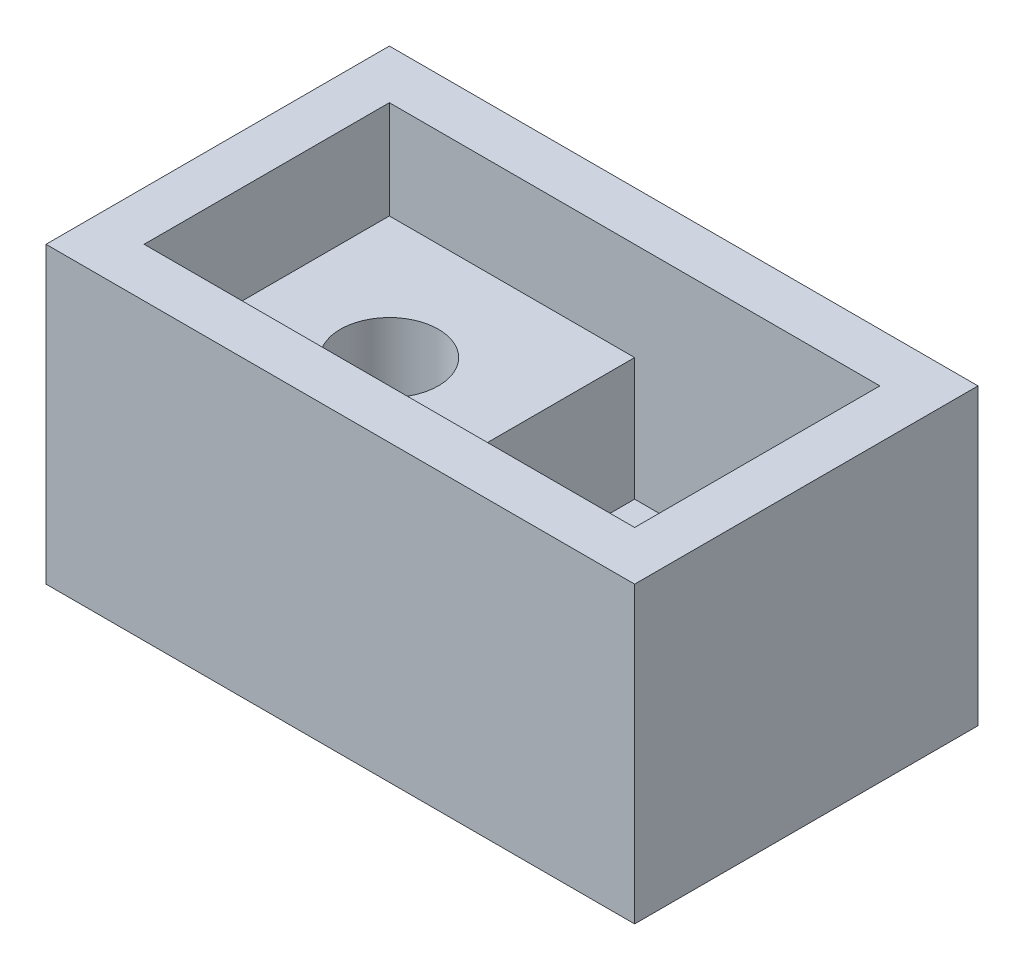
ISO-10303-21;
HEADER;
FILE_DESCRIPTION(('STEP AP214'),'2;1');
FILE_NAME('part.step','',(''),(''),'','','');
FILE_SCHEMA(('AUTOMOTIVE_DESIGN { 1 0 10303 214 1 1 1 1 }'));
ENDSEC;
DATA;
#1=APPLICATION_CONTEXT('core data for automotive mechanical design processes');
#2=APPLICATION_PROTOCOL_DEFINITION('international standard','automotive_design',2000,#1);
#3=PRODUCT_CONTEXT('',#1,'mechanical');
#4=PRODUCT('Part','Part','',(#3));
#5=PRODUCT_RELATED_PRODUCT_CATEGORY('part','',(#4));
#6=PRODUCT_DEFINITION_FORMATION('','',#4);
#7=PRODUCT_DEFINITION_CONTEXT('part definition',#1,'design');
#8=PRODUCT_DEFINITION('design','',#6,#7);
#9=PRODUCT_DEFINITION_SHAPE('','',#8);
#10=(LENGTH_UNIT() NAMED_UNIT(*) SI_UNIT(.MILLI.,.METRE.));
#11=(NAMED_UNIT(*) PLANE_ANGLE_UNIT() SI_UNIT($,.RADIAN.));
#12=(NAMED_UNIT(*) SI_UNIT($,.STERADIAN.) SOLID_ANGLE_UNIT());
#13=UNCERTAINTY_MEASURE_WITH_UNIT(LENGTH_MEASURE(1.E-05),#10,'distance_accuracy_value','');
#14=(GEOMETRIC_REPRESENTATION_CONTEXT(3) GLOBAL_UNCERTAINTY_ASSIGNED_CONTEXT((#13)) GLOBAL_UNIT_ASSIGNED_CONTEXT((#10,
#11,#12)) REPRESENTATION_CONTEXT('',''));
#15=CARTESIAN_POINT('',(0.,0.,0.));
#16=DIRECTION('',(0.,0.,1.));
#17=DIRECTION('',(1.,0.,0.));
#18=AXIS2_PLACEMENT_3D('',#15,#16,#17);
#19=CARTESIAN_POINT('',(88.9,-152.4,-88.9));
#20=DIRECTION('',(0.,1.,0.));
#21=DIRECTION('',(0.,0.,1.));
#22=AXIS2_PLACEMENT_3D('',#19,#20,#21);
#23=CYLINDRICAL_SURFACE('',#22,25.4);
#24=CARTESIAN_POINT('',(88.9,-152.4,-88.9));
#25=DIRECTION('',(0.,1.,0.));
#26=DIRECTION('',(0.,0.,1.));
#27=AXIS2_PLACEMENT_3D('',#24,#25,#26);
#28=CIRCLE('',#27,25.4);
#29=CARTESIAN_POINT('',(88.9,-152.4,-63.5));
#30=VERTEX_POINT('',#29);
#31=EDGE_CURVE('E180',#30,#30,#28,.T.);
#32=CARTESIAN_POINT('',(88.9,-50.8,-88.9));
#33=DIRECTION('',(0.,1.,0.));
#34=DIRECTION('',(0.,0.,1.));
#35=AXIS2_PLACEMENT_3D('',#32,#33,#34);
#36=CIRCLE('',#35,25.4);
#37=CARTESIAN_POINT('',(88.9,-50.8,-63.5));
#38=VERTEX_POINT('',#37);
#39=EDGE_CURVE('E175',#38,#38,#36,.F.);
#40=CARTESIAN_POINT('',(88.9,-152.4,-63.5));
#41=CARTESIAN_POINT('',(88.9,-151.341666666667,-63.5));
#42=CARTESIAN_POINT('',(88.9,-150.283333333333,-63.5));
#43=CARTESIAN_POINT('',(88.9,-148.166666666667,-63.5));
#44=CARTESIAN_POINT('',(88.9,-147.108333333333,-63.5));
#45=CARTESIAN_POINT('',(88.9,-144.991666666667,-63.5));
#46=CARTESIAN_POINT('',(88.9,-143.933333333333,-63.5));
#47=CARTESIAN_POINT('',(88.9,-141.816666666667,-63.5));
#48=CARTESIAN_POINT('',(88.9,-140.758333333333,-63.5));
#49=CARTESIAN_POINT('',(88.9,-138.641666666667,-63.5));
#50=CARTESIAN_POINT('',(88.9,-137.583333333333,-63.5));
#51=CARTESIAN_POINT('',(88.9,-135.466666666667,-63.5));
#52=CARTESIAN_POINT('',(88.9,-134.408333333333,-63.5));
#53=CARTESIAN_POINT('',(88.9,-132.291666666667,-63.5));
#54=CARTESIAN_POINT('',(88.9,-131.233333333333,-63.5));
#55=CARTESIAN_POINT('',(88.9,-129.116666666667,-63.5));
#56=CARTESIAN_POINT('',(88.9,-128.058333333333,-63.5));
#57=CARTESIAN_POINT('',(88.9,-125.941666666667,-63.5));
#58=CARTESIAN_POINT('',(88.9,-124.883333333333,-63.5));
#59=CARTESIAN_POINT('',(88.9,-122.766666666667,-63.5));
#60=CARTESIAN_POINT('',(88.9,-121.708333333333,-63.5));
#61=CARTESIAN_POINT('',(88.9,-119.591666666667,-63.5));
#62=CARTESIAN_POINT('',(88.9,-118.533333333333,-63.5));
#63=CARTESIAN_POINT('',(88.9,-116.416666666667,-63.5));
#64=CARTESIAN_POINT('',(88.9,-115.358333333333,-63.5));
#65=CARTESIAN_POINT('',(88.9,-113.241666666667,-63.5));
#66=CARTESIAN_POINT('',(88.9,-112.183333333333,-63.5));
#67=CARTESIAN_POINT('',(88.9,-110.066666666667,-63.5));
#68=CARTESIAN_POINT('',(88.9,-109.008333333333,-63.5));
#69=CARTESIAN_POINT('',(88.9,-106.891666666667,-63.5));
#70=CARTESIAN_POINT('',(88.9,-105.833333333333,-63.5));
#71=CARTESIAN_POINT('',(88.9,-103.716666666667,-63.5));
#72=CARTESIAN_POINT('',(88.9,-102.658333333333,-63.5));
#73=CARTESIAN_POINT('',(88.9,-100.541666666667,-63.5));
#74=CARTESIAN_POINT('',(88.9,-99.4833333333333,-63.5));
#75=CARTESIAN_POINT('',(88.9,-97.3666666666667,-63.5));
#76=CARTESIAN_POINT('',(88.9,-96.3083333333333,-63.5));
#77=CARTESIAN_POINT('',(88.9,-94.1916666666667,-63.5));
#78=CARTESIAN_POINT('',(88.9,-93.1333333333333,-63.5));
#79=CARTESIAN_POINT('',(88.9,-91.0166666666667,-63.5));
#80=CARTESIAN_POINT('',(88.9,-89.9583333333333,-63.5));
#81=CARTESIAN_POINT('',(88.9,-87.8416666666667,-63.5));
#82=CARTESIAN_POINT('',(88.9,-86.7833333333333,-63.5));
#83=CARTESIAN_POINT('',(88.9,-84.6666666666667,-63.5));
#84=CARTESIAN_POINT('',(88.9,-83.6083333333333,-63.5));
#85=CARTESIAN_POINT('',(88.9,-81.4916666666667,-63.5));
#86=CARTESIAN_POINT('',(88.9,-80.4333333333333,-63.5));
#87=CARTESIAN_POINT('',(88.9,-78.3166666666667,-63.5));
#88=CARTESIAN_POINT('',(88.9,-77.2583333333333,-63.5));
#89=CARTESIAN_POINT('',(88.9,-75.1416666666667,-63.5));
#90=CARTESIAN_POINT('',(88.9,-74.0833333333333,-63.5));
#91=CARTESIAN_POINT('',(88.9,-71.9666666666667,-63.5));
#92=CARTESIAN_POINT('',(88.9,-70.9083333333333,-63.5));
#93=CARTESIAN_POINT('',(88.9,-68.7916666666667,-63.5));
#94=CARTESIAN_POINT('',(88.9,-67.7333333333333,-63.5));
#95=CARTESIAN_POINT('',(88.9,-65.6166666666667,-63.5));
#96=CARTESIAN_POINT('',(88.9,-64.5583333333333,-63.5));
#97=CARTESIAN_POINT('',(88.9,-62.4416666666667,-63.5));
#98=CARTESIAN_POINT('',(88.9,-61.3833333333333,-63.5));
#99=CARTESIAN_POINT('',(88.9,-59.2666666666667,-63.5));
#100=CARTESIAN_POINT('',(88.9,-58.2083333333333,-63.5));
#101=CARTESIAN_POINT('',(88.9,-56.0916666666667,-63.5));
#102=CARTESIAN_POINT('',(88.9,-55.0333333333333,-63.5));
#103=CARTESIAN_POINT('',(88.9,-52.9166666666667,-63.5));
#104=CARTESIAN_POINT('',(88.9,-51.8583333333333,-63.5));
#105=CARTESIAN_POINT('',(88.9,-50.8,-63.5));
#106=B_SPLINE_CURVE_WITH_KNOTS('',3,(#40,#41,#42,#43,#44,#45,#46,#47,#48,#49,#50,#51,#52,#53,
#54,#55,#56,#57,#58,#59,#60,#61,#62,#63,#64,#65,#66,#67,#68,#69,#70,#71,#72,#73,#74,#75,#76,#77,
#78,#79,#80,#81,#82,#83,#84,#85,#86,#87,#88,#89,#90,#91,#92,#93,#94,#95,#96,#97,#98,#99,#100,
#101,#102,#103,#104,#105),.UNSPECIFIED.,.F.,.F.,(4,2,2,2,2,2,2,2,2,2,2,2,2,2,2,2,2,2,2,2,2,2,2,
2,2,2,2,2,2,2,2,2,4),(0.,3.17500000000001,6.35000000000002,9.52500000000001,12.7,15.875,19.05,
22.225,25.4,28.575,31.75,34.925,38.1,41.275,44.45,47.625,50.8,53.975,57.15,60.325,63.5,66.675,
69.85,73.025,76.2,79.375,82.55,85.725,88.9,92.075,95.25,98.425,101.6),.UNSPECIFIED.);
#107=EDGE_CURVE('BSEAM35',#30,#38,#106,.T.);
#108=ORIENTED_EDGE('',*,*,#31,.F.);
#109=ORIENTED_EDGE('',*,*,#39,.F.);
#110=ORIENTED_EDGE('',*,*,#107,.T.);
#111=ORIENTED_EDGE('',*,*,#107,.F.);
#112=EDGE_LOOP('',(#108,#110,#109,#111));
#113=FACE_BOUND('',#112,.T.);
#114=ADVANCED_FACE('F35',(#113),#23,.F.);
#115=CARTESIAN_POINT('',(0.,-152.4,0.));
#116=DIRECTION('',(0.,0.,1.));
#117=DIRECTION('',(1.,0.,0.));
#118=AXIS2_PLACEMENT_3D('',#115,#116,#117);
#119=PLANE('',#118);
#120=DIRECTION('',(1.,0.,0.));
#121=VECTOR('',#120,1.);
#122=CARTESIAN_POINT('',(0.,0.,0.));
#123=LINE('',#122,#121);
#124=CARTESIAN_POINT('',(0.,0.,0.));
#125=VERTEX_POINT('',#124);
#126=CARTESIAN_POINT('',(304.8,0.,0.));
#127=VERTEX_POINT('',#126);
#128=EDGE_CURVE('E183',#125,#127,#123,.T.);
#129=ORIENTED_EDGE('',*,*,#128,.F.);
#130=DIRECTION('',(0.,1.,0.));
#131=VECTOR('',#130,1.);
#132=CARTESIAN_POINT('',(0.,-152.4,0.));
#133=LINE('',#132,#131);
#134=CARTESIAN_POINT('',(0.,-152.4,0.));
#135=VERTEX_POINT('',#134);
#136=EDGE_CURVE('E11',#135,#125,#133,.T.);
#137=ORIENTED_EDGE('',*,*,#136,.F.);
#138=DIRECTION('',(1.,0.,0.));
#139=VECTOR('',#138,1.);
#140=CARTESIAN_POINT('',(0.,-152.4,0.));
#141=LINE('',#140,#139);
#142=CARTESIAN_POINT('',(304.8,-152.4,0.));
#143=VERTEX_POINT('',#142);
#144=EDGE_CURVE('E184',#135,#143,#141,.T.);
#145=ORIENTED_EDGE('',*,*,#144,.T.);
#146=DIRECTION('',(0.,1.,0.));
#147=VECTOR('',#146,1.);
#148=CARTESIAN_POINT('',(304.8,-152.4,0.));
#149=LINE('',#148,#147);
#150=EDGE_CURVE('E84',#143,#127,#149,.T.);
#151=ORIENTED_EDGE('',*,*,#150,.T.);
#152=EDGE_LOOP('',(#129,#137,#145,#151));
#153=FACE_BOUND('',#152,.T.);
#154=ADVANCED_FACE('F37',(#153),#119,.T.);
#155=CARTESIAN_POINT('',(0.,-152.4,0.));
#156=DIRECTION('',(1.,0.,0.));
#157=DIRECTION('',(0.,0.,-1.));
#158=AXIS2_PLACEMENT_3D('',#155,#156,#157);
#159=PLANE('',#158);
#160=DIRECTION('',(0.,0.,-1.));
#161=VECTOR('',#160,1.);
#162=CARTESIAN_POINT('',(0.,0.,0.));
#163=LINE('',#162,#161);
#164=CARTESIAN_POINT('',(0.,0.,-177.8));
#165=VERTEX_POINT('',#164);
#166=EDGE_CURVE('E187',#125,#165,#163,.T.);
#167=ORIENTED_EDGE('',*,*,#166,.T.);
#168=DIRECTION('',(0.,1.,0.));
#169=VECTOR('',#168,1.);
#170=CARTESIAN_POINT('',(0.,-152.4,-177.8));
#171=LINE('',#170,#169);
#172=CARTESIAN_POINT('',(0.,-152.4,-177.8));
#173=VERTEX_POINT('',#172);
#174=EDGE_CURVE('E44',#173,#165,#171,.T.);
#175=ORIENTED_EDGE('',*,*,#174,.F.);
#176=DIRECTION('',(0.,0.,-1.));
#177=VECTOR('',#176,1.);
#178=CARTESIAN_POINT('',(0.,-152.4,0.));
#179=LINE('',#178,#177);
#180=EDGE_CURVE('E191',#135,#173,#179,.T.);
#181=ORIENTED_EDGE('',*,*,#180,.F.);
#182=ORIENTED_EDGE('',*,*,#136,.T.);
#183=EDGE_LOOP('',(#167,#175,#181,#182));
#184=FACE_BOUND('',#183,.T.);
#185=ADVANCED_FACE('F217',(#184),#159,.F.);
#186=CARTESIAN_POINT('',(0.,-152.4,-177.8));
#187=DIRECTION('',(0.,0.,1.));
#188=DIRECTION('',(1.,0.,0.));
#189=AXIS2_PLACEMENT_3D('',#186,#187,#188);
#190=PLANE('',#189);
#191=DIRECTION('',(1.,0.,0.));
#192=VECTOR('',#191,1.);
#193=CARTESIAN_POINT('',(0.,0.,-177.8));
#194=LINE('',#193,#192);
#195=CARTESIAN_POINT('',(304.8,0.,-177.8));
#196=VERTEX_POINT('',#195);
#197=EDGE_CURVE('E198',#165,#196,#194,.T.);
#198=ORIENTED_EDGE('',*,*,#197,.T.);
#199=DIRECTION('',(0.,1.,0.));
#200=VECTOR('',#199,1.);
#201=CARTESIAN_POINT('',(304.8,-152.4,-177.8));
#202=LINE('',#201,#200);
#203=CARTESIAN_POINT('',(304.8,-152.4,-177.8));
#204=VERTEX_POINT('',#203);
#205=EDGE_CURVE('E204',#204,#196,#202,.T.);
#206=ORIENTED_EDGE('',*,*,#205,.F.);
#207=DIRECTION('',(1.,0.,0.));
#208=VECTOR('',#207,1.);
#209=CARTESIAN_POINT('',(0.,-152.4,-177.8));
#210=LINE('',#209,#208);
#211=EDGE_CURVE('E189',#173,#204,#210,.T.);
#212=ORIENTED_EDGE('',*,*,#211,.F.);
#213=ORIENTED_EDGE('',*,*,#174,.T.);
#214=EDGE_LOOP('',(#198,#206,#212,#213));
#215=FACE_BOUND('',#214,.T.);
#216=ADVANCED_FACE('F237',(#215),#190,.F.);
#217=CARTESIAN_POINT('',(304.8,-152.4,0.));
#218=DIRECTION('',(1.,0.,0.));
#219=DIRECTION('',(0.,0.,-1.));
#220=AXIS2_PLACEMENT_3D('',#217,#218,#219);
#221=PLANE('',#220);
#222=DIRECTION('',(0.,0.,-1.));
#223=VECTOR('',#222,1.);
#224=CARTESIAN_POINT('',(304.8,0.,0.));
#225=LINE('',#224,#223);
#226=EDGE_CURVE('E195',#127,#196,#225,.T.);
#227=ORIENTED_EDGE('',*,*,#226,.F.);
#228=ORIENTED_EDGE('',*,*,#150,.F.);
#229=DIRECTION('',(0.,0.,-1.));
#230=VECTOR('',#229,1.);
#231=CARTESIAN_POINT('',(304.8,-152.4,0.));
#232=LINE('',#231,#230);
#233=EDGE_CURVE('E186',#143,#204,#232,.T.);
#234=ORIENTED_EDGE('',*,*,#233,.T.);
#235=ORIENTED_EDGE('',*,*,#205,.T.);
#236=EDGE_LOOP('',(#227,#228,#234,#235));
#237=FACE_BOUND('',#236,.T.);
#238=ADVANCED_FACE('F230',(#237),#221,.T.);
#239=CARTESIAN_POINT('',(0.,-152.4,0.));
#240=DIRECTION('',(0.,1.,0.));
#241=DIRECTION('',(0.,0.,1.));
#242=AXIS2_PLACEMENT_3D('',#239,#240,#241);
#243=PLANE('',#242);
#244=ORIENTED_EDGE('',*,*,#144,.F.);
#245=ORIENTED_EDGE('',*,*,#180,.T.);
#246=ORIENTED_EDGE('',*,*,#211,.T.);
#247=ORIENTED_EDGE('',*,*,#233,.F.);
#248=EDGE_LOOP('',(#244,#245,#246,#247));
#249=FACE_BOUND('',#248,.T.);
#250=CARTESIAN_POINT('',(215.9,-152.4,-88.9));
#251=DIRECTION('',(0.,1.,0.));
#252=DIRECTION('',(0.,0.,1.));
#253=AXIS2_PLACEMENT_3D('',#250,#251,#252);
#254=CIRCLE('',#253,25.4);
#255=CARTESIAN_POINT('',(215.9,-152.4,-63.5));
#256=VERTEX_POINT('',#255);
#257=EDGE_CURVE('E177',#256,#256,#254,.T.);
#258=ORIENTED_EDGE('',*,*,#257,.T.);
#259=EDGE_LOOP('',(#258));
#260=FACE_BOUND('',#259,.T.);
#261=ORIENTED_EDGE('',*,*,#31,.T.);
#262=EDGE_LOOP('',(#261));
#263=FACE_BOUND('',#262,.T.);
#264=ADVANCED_FACE('F227',(#249,#260,#263),#243,.F.);
#265=CARTESIAN_POINT('',(0.,0.,0.));
#266=DIRECTION('',(0.,1.,0.));
#267=DIRECTION('',(0.,0.,1.));
#268=AXIS2_PLACEMENT_3D('',#265,#266,#267);
#269=PLANE('',#268);
#270=DIRECTION('',(0.,0.,-1.));
#271=VECTOR('',#270,1.);
#272=CARTESIAN_POINT('',(279.4,0.,-152.4));
#273=LINE('',#272,#271);
#274=CARTESIAN_POINT('',(279.4,0.,-25.4));
#275=VERTEX_POINT('',#274);
#276=CARTESIAN_POINT('',(279.4,0.,-152.4));
#277=VERTEX_POINT('',#276);
#278=EDGE_CURVE('E128',#275,#277,#273,.T.);
#279=ORIENTED_EDGE('',*,*,#278,.F.);
#280=DIRECTION('',(-1.,0.,0.));
#281=VECTOR('',#280,1.);
#282=CARTESIAN_POINT('',(0.,0.,-25.4));
#283=LINE('',#282,#281);
#284=CARTESIAN_POINT('',(25.4,0.,-25.4));
#285=VERTEX_POINT('',#284);
#286=EDGE_CURVE('E158',#275,#285,#283,.T.);
#287=ORIENTED_EDGE('',*,*,#286,.T.);
#288=DIRECTION('',(0.,0.,1.));
#289=VECTOR('',#288,1.);
#290=CARTESIAN_POINT('',(25.4,0.,0.));
#291=LINE('',#290,#289);
#292=CARTESIAN_POINT('',(25.4,0.,-152.4));
#293=VERTEX_POINT('',#292);
#294=EDGE_CURVE('E168',#293,#285,#291,.T.);
#295=ORIENTED_EDGE('',*,*,#294,.F.);
#296=DIRECTION('',(-1.,0.,0.));
#297=VECTOR('',#296,1.);
#298=CARTESIAN_POINT('',(0.,0.,-152.4));
#299=LINE('',#298,#297);
#300=EDGE_CURVE('E52',#277,#293,#299,.T.);
#301=ORIENTED_EDGE('',*,*,#300,.F.);
#302=EDGE_LOOP('',(#279,#287,#295,#301));
#303=FACE_BOUND('',#302,.T.);
#304=ORIENTED_EDGE('',*,*,#128,.T.);
#305=ORIENTED_EDGE('',*,*,#226,.T.);
#306=ORIENTED_EDGE('',*,*,#197,.F.);
#307=ORIENTED_EDGE('',*,*,#166,.F.);
#308=EDGE_LOOP('',(#304,#305,#306,#307));
#309=FACE_BOUND('',#308,.T.);
#310=ADVANCED_FACE('F225',(#303,#309),#269,.T.);
#311=CARTESIAN_POINT('',(215.9,-152.4,-88.9));
#312=DIRECTION('',(0.,1.,0.));
#313=DIRECTION('',(0.,0.,1.));
#314=AXIS2_PLACEMENT_3D('',#311,#312,#313);
#315=CYLINDRICAL_SURFACE('',#314,25.4);
#316=CARTESIAN_POINT('',(215.9,-114.3,-88.9));
#317=DIRECTION('',(0.,-1.,0.));
#318=DIRECTION('',(0.,0.,-1.));
#319=AXIS2_PLACEMENT_3D('',#316,#317,#318);
#320=CIRCLE('',#319,25.4);
#321=CARTESIAN_POINT('',(215.9,-114.3,-63.5));
#322=VERTEX_POINT('',#321);
#323=EDGE_CURVE('E39',#322,#322,#320,.F.);
#324=CARTESIAN_POINT('',(215.9,-114.3,-63.5));
#325=CARTESIAN_POINT('',(215.9,-114.696875,-63.5));
#326=CARTESIAN_POINT('',(215.9,-115.09375,-63.5));
#327=CARTESIAN_POINT('',(215.9,-115.8875,-63.5));
#328=CARTESIAN_POINT('',(215.9,-116.284375,-63.5));
#329=CARTESIAN_POINT('',(215.9,-117.078125,-63.5));
#330=CARTESIAN_POINT('',(215.9,-117.475,-63.5));
#331=CARTESIAN_POINT('',(215.9,-118.26875,-63.5));
#332=CARTESIAN_POINT('',(215.9,-118.665625,-63.5));
#333=CARTESIAN_POINT('',(215.9,-119.459375,-63.5));
#334=CARTESIAN_POINT('',(215.9,-119.85625,-63.5));
#335=CARTESIAN_POINT('',(215.9,-120.65,-63.5));
#336=CARTESIAN_POINT('',(215.9,-121.046875,-63.5));
#337=CARTESIAN_POINT('',(215.9,-121.840625,-63.5));
#338=CARTESIAN_POINT('',(215.9,-122.2375,-63.5));
#339=CARTESIAN_POINT('',(215.9,-123.03125,-63.5));
#340=CARTESIAN_POINT('',(215.9,-123.428125,-63.5));
#341=CARTESIAN_POINT('',(215.9,-124.221875,-63.5));
#342=CARTESIAN_POINT('',(215.9,-124.61875,-63.5));
#343=CARTESIAN_POINT('',(215.9,-125.4125,-63.5));
#344=CARTESIAN_POINT('',(215.9,-125.809375,-63.5));
#345=CARTESIAN_POINT('',(215.9,-126.603125,-63.5));
#346=CARTESIAN_POINT('',(215.9,-127.,-63.5));
#347=CARTESIAN_POINT('',(215.9,-127.79375,-63.5));
#348=CARTESIAN_POINT('',(215.9,-128.190625,-63.5));
#349=CARTESIAN_POINT('',(215.9,-128.984375,-63.5));
#350=CARTESIAN_POINT('',(215.9,-129.38125,-63.5));
#351=CARTESIAN_POINT('',(215.9,-130.175,-63.5));
#352=CARTESIAN_POINT('',(215.9,-130.571875,-63.5));
#353=CARTESIAN_POINT('',(215.9,-131.365625,-63.5));
#354=CARTESIAN_POINT('',(215.9,-131.7625,-63.5));
#355=CARTESIAN_POINT('',(215.9,-132.55625,-63.5));
#356=CARTESIAN_POINT('',(215.9,-132.953125,-63.5));
#357=CARTESIAN_POINT('',(215.9,-133.746875,-63.5));
#358=CARTESIAN_POINT('',(215.9,-134.14375,-63.5));
#359=CARTESIAN_POINT('',(215.9,-134.9375,-63.5));
#360=CARTESIAN_POINT('',(215.9,-135.334375,-63.5));
#361=CARTESIAN_POINT('',(215.9,-136.128125,-63.5));
#362=CARTESIAN_POINT('',(215.9,-136.525,-63.5));
#363=CARTESIAN_POINT('',(215.9,-137.31875,-63.5));
#364=CARTESIAN_POINT('',(215.9,-137.715625,-63.5));
#365=CARTESIAN_POINT('',(215.9,-138.509375,-63.5));
#366=CARTESIAN_POINT('',(215.9,-138.90625,-63.5));
#367=CARTESIAN_POINT('',(215.9,-139.7,-63.5));
#368=CARTESIAN_POINT('',(215.9,-140.096875,-63.5));
#369=CARTESIAN_POINT('',(215.9,-140.890625,-63.5));
#370=CARTESIAN_POINT('',(215.9,-141.2875,-63.5));
#371=CARTESIAN_POINT('',(215.9,-142.08125,-63.5));
#372=CARTESIAN_POINT('',(215.9,-142.478125,-63.5));
#373=CARTESIAN_POINT('',(215.9,-143.271875,-63.5));
#374=CARTESIAN_POINT('',(215.9,-143.66875,-63.5));
#375=CARTESIAN_POINT('',(215.9,-144.4625,-63.5));
#376=CARTESIAN_POINT('',(215.9,-144.859375,-63.5));
#377=CARTESIAN_POINT('',(215.9,-145.653125,-63.5));
#378=CARTESIAN_POINT('',(215.9,-146.05,-63.5));
#379=CARTESIAN_POINT('',(215.9,-146.84375,-63.5));
#380=CARTESIAN_POINT('',(215.9,-147.240625,-63.5));
#381=CARTESIAN_POINT('',(215.9,-148.034375,-63.5));
#382=CARTESIAN_POINT('',(215.9,-148.43125,-63.5));
#383=CARTESIAN_POINT('',(215.9,-149.225,-63.5));
#384=CARTESIAN_POINT('',(215.9,-149.621875,-63.5));
#385=CARTESIAN_POINT('',(215.9,-150.415625,-63.5));
#386=CARTESIAN_POINT('',(215.9,-150.8125,-63.5));
#387=CARTESIAN_POINT('',(215.9,-151.60625,-63.5));
#388=CARTESIAN_POINT('',(215.9,-152.003125,-63.5));
#389=CARTESIAN_POINT('',(215.9,-152.4,-63.5));
#390=B_SPLINE_CURVE_WITH_KNOTS('',3,(#324,#325,#326,#327,#328,#329,#330,#331,#332,#333,#334,
#335,#336,#337,#338,#339,#340,#341,#342,#343,#344,#345,#346,#347,#348,#349,#350,#351,#352,#353,
#354,#355,#356,#357,#358,#359,#360,#361,#362,#363,#364,#365,#366,#367,#368,#369,#370,#371,#372,
#373,#374,#375,#376,#377,#378,#379,#380,#381,#382,#383,#384,#385,#386,#387,#388,#389),
.UNSPECIFIED.,.F.,.F.,(4,2,2,2,2,2,2,2,2,2,2,2,2,2,2,2,2,2,2,2,2,2,2,2,2,2,2,2,2,2,2,2,4),(0.,
1.190625,2.38125,3.571875,4.7625,5.953125,7.14375,8.334375,9.52500000000001,10.715625,11.90625,
13.096875,14.2875,15.478125,16.66875,17.859375,19.05,20.240625,21.43125,22.621875,23.8125,
25.003125,26.19375,27.384375,28.575,29.765625,30.95625,32.146875,33.3375,34.528125,35.71875,
36.909375,38.1),.UNSPECIFIED.);
#391=EDGE_CURVE('BSEAM222',#322,#256,#390,.T.);
#392=ORIENTED_EDGE('',*,*,#323,.T.);
#393=ORIENTED_EDGE('',*,*,#257,.F.);
#394=ORIENTED_EDGE('',*,*,#391,.T.);
#395=ORIENTED_EDGE('',*,*,#391,.F.);
#396=EDGE_LOOP('',(#392,#394,#393,#395));
#397=FACE_BOUND('',#396,.T.);
#398=ADVANCED_FACE('F222',(#397),#315,.F.);
#399=CARTESIAN_POINT('',(0.,-50.8,0.));
#400=DIRECTION('',(0.,1.,0.));
#401=DIRECTION('',(0.,0.,1.));
#402=AXIS2_PLACEMENT_3D('',#399,#400,#401);
#403=PLANE('',#402);
#404=DIRECTION('',(-1.,0.,0.));
#405=VECTOR('',#404,1.);
#406=CARTESIAN_POINT('',(0.,-50.8,-152.4));
#407=LINE('',#406,#405);
#408=CARTESIAN_POINT('',(152.4,-50.8,-152.4));
#409=VERTEX_POINT('',#408);
#410=CARTESIAN_POINT('',(25.4,-50.8,-152.4));
#411=VERTEX_POINT('',#410);
#412=EDGE_CURVE('E154',#409,#411,#407,.T.);
#413=ORIENTED_EDGE('',*,*,#412,.T.);
#414=DIRECTION('',(0.,0.,1.));
#415=VECTOR('',#414,1.);
#416=CARTESIAN_POINT('',(25.4,-50.8,0.));
#417=LINE('',#416,#415);
#418=CARTESIAN_POINT('',(25.4,-50.8,-25.4));
#419=VERTEX_POINT('',#418);
#420=EDGE_CURVE('E157',#411,#419,#417,.T.);
#421=ORIENTED_EDGE('',*,*,#420,.T.);
#422=DIRECTION('',(-1.,0.,0.));
#423=VECTOR('',#422,1.);
#424=CARTESIAN_POINT('',(0.,-50.8,-25.4));
#425=LINE('',#424,#423);
#426=CARTESIAN_POINT('',(152.4,-50.8,-25.4));
#427=VERTEX_POINT('',#426);
#428=EDGE_CURVE('E161',#427,#419,#425,.T.);
#429=ORIENTED_EDGE('',*,*,#428,.F.);
#430=DIRECTION('',(0.,0.,1.));
#431=VECTOR('',#430,1.);
#432=CARTESIAN_POINT('',(152.4,-50.8,0.));
#433=LINE('',#432,#431);
#434=EDGE_CURVE('E163',#409,#427,#433,.T.);
#435=ORIENTED_EDGE('',*,*,#434,.F.);
#436=EDGE_LOOP('',(#413,#421,#429,#435));
#437=FACE_BOUND('',#436,.T.);
#438=ORIENTED_EDGE('',*,*,#39,.T.);
#439=EDGE_LOOP('',(#438));
#440=FACE_BOUND('',#439,.T.);
#441=ADVANCED_FACE('F209',(#437,#440),#403,.T.);
#442=CARTESIAN_POINT('',(0.,-50.8,-152.4));
#443=DIRECTION('',(0.,0.,-1.));
#444=DIRECTION('',(-1.,0.,0.));
#445=AXIS2_PLACEMENT_3D('',#442,#443,#444);
#446=PLANE('',#445);
#447=ORIENTED_EDGE('',*,*,#300,.T.);
#448=DIRECTION('',(0.,1.,0.));
#449=VECTOR('',#448,1.);
#450=CARTESIAN_POINT('',(25.4,-50.8,-152.4));
#451=LINE('',#450,#449);
#452=EDGE_CURVE('E166',#411,#293,#451,.T.);
#453=ORIENTED_EDGE('',*,*,#452,.F.);
#454=ORIENTED_EDGE('',*,*,#412,.F.);
#455=DIRECTION('',(0.,1.,0.));
#456=VECTOR('',#455,1.);
#457=CARTESIAN_POINT('',(152.4,-114.3,-152.4));
#458=LINE('',#457,#456);
#459=CARTESIAN_POINT('',(152.4,-114.3,-152.4));
#460=VERTEX_POINT('',#459);
#461=EDGE_CURVE('E129',#460,#409,#458,.T.);
#462=ORIENTED_EDGE('',*,*,#461,.F.);
#463=DIRECTION('',(-1.,0.,0.));
#464=VECTOR('',#463,1.);
#465=CARTESIAN_POINT('',(279.4,-114.3,-152.4));
#466=LINE('',#465,#464);
#467=CARTESIAN_POINT('',(279.4,-114.3,-152.4));
#468=VERTEX_POINT('',#467);
#469=EDGE_CURVE('E133',#468,#460,#466,.T.);
#470=ORIENTED_EDGE('',*,*,#469,.F.);
#471=DIRECTION('',(0.,1.,0.));
#472=VECTOR('',#471,1.);
#473=CARTESIAN_POINT('',(279.4,-114.3,-152.4));
#474=LINE('',#473,#472);
#475=EDGE_CURVE('E120',#468,#277,#474,.T.);
#476=ORIENTED_EDGE('',*,*,#475,.T.);
#477=EDGE_LOOP('',(#447,#453,#454,#462,#470,#476));
#478=FACE_BOUND('',#477,.T.);
#479=ADVANCED_FACE('F134',(#478),#446,.F.);
#480=CARTESIAN_POINT('',(0.,-50.8,-25.4));
#481=DIRECTION('',(0.,0.,-1.));
#482=DIRECTION('',(-1.,0.,0.));
#483=AXIS2_PLACEMENT_3D('',#480,#481,#482);
#484=PLANE('',#483);
#485=ORIENTED_EDGE('',*,*,#286,.F.);
#486=DIRECTION('',(0.,1.,0.));
#487=VECTOR('',#486,1.);
#488=CARTESIAN_POINT('',(279.4,-114.3,-25.4));
#489=LINE('',#488,#487);
#490=CARTESIAN_POINT('',(279.4,-114.3,-25.4));
#491=VERTEX_POINT('',#490);
#492=EDGE_CURVE('E149',#491,#275,#489,.T.);
#493=ORIENTED_EDGE('',*,*,#492,.F.);
#494=DIRECTION('',(1.,0.,0.));
#495=VECTOR('',#494,1.);
#496=CARTESIAN_POINT('',(279.4,-114.3,-25.4));
#497=LINE('',#496,#495);
#498=CARTESIAN_POINT('',(152.4,-114.3,-25.4));
#499=VERTEX_POINT('',#498);
#500=EDGE_CURVE('E130',#499,#491,#497,.T.);
#501=ORIENTED_EDGE('',*,*,#500,.F.);
#502=DIRECTION('',(0.,1.,0.));
#503=VECTOR('',#502,1.);
#504=CARTESIAN_POINT('',(152.4,-114.3,-25.4));
#505=LINE('',#504,#503);
#506=EDGE_CURVE('E151',#499,#427,#505,.T.);
#507=ORIENTED_EDGE('',*,*,#506,.T.);
#508=ORIENTED_EDGE('',*,*,#428,.T.);
#509=DIRECTION('',(0.,1.,0.));
#510=VECTOR('',#509,1.);
#511=CARTESIAN_POINT('',(25.4,-50.8,-25.4));
#512=LINE('',#511,#510);
#513=EDGE_CURVE('E173',#419,#285,#512,.T.);
#514=ORIENTED_EDGE('',*,*,#513,.T.);
#515=EDGE_LOOP('',(#485,#493,#501,#507,#508,#514));
#516=FACE_BOUND('',#515,.T.);
#517=ADVANCED_FACE('F281',(#516),#484,.T.);
#518=CARTESIAN_POINT('',(25.4,-50.8,0.));
#519=DIRECTION('',(-1.,0.,0.));
#520=DIRECTION('',(0.,0.,1.));
#521=AXIS2_PLACEMENT_3D('',#518,#519,#520);
#522=PLANE('',#521);
#523=ORIENTED_EDGE('',*,*,#294,.T.);
#524=ORIENTED_EDGE('',*,*,#513,.F.);
#525=ORIENTED_EDGE('',*,*,#420,.F.);
#526=ORIENTED_EDGE('',*,*,#452,.T.);
#527=EDGE_LOOP('',(#523,#524,#525,#526));
#528=FACE_BOUND('',#527,.T.);
#529=ADVANCED_FACE('F287',(#528),#522,.F.);
#530=CARTESIAN_POINT('',(0.,-114.3,0.));
#531=DIRECTION('',(0.,-1.,0.));
#532=DIRECTION('',(0.,0.,-1.));
#533=AXIS2_PLACEMENT_3D('',#530,#531,#532);
#534=PLANE('',#533);
#535=DIRECTION('',(0.,0.,-1.));
#536=VECTOR('',#535,1.);
#537=CARTESIAN_POINT('',(279.4,-114.3,-152.4));
#538=LINE('',#537,#536);
#539=EDGE_CURVE('E125',#491,#468,#538,.T.);
#540=ORIENTED_EDGE('',*,*,#539,.T.);
#541=ORIENTED_EDGE('',*,*,#469,.T.);
#542=DIRECTION('',(0.,0.,1.));
#543=VECTOR('',#542,1.);
#544=CARTESIAN_POINT('',(152.4,-114.3,-152.4));
#545=LINE('',#544,#543);
#546=EDGE_CURVE('E139',#460,#499,#545,.T.);
#547=ORIENTED_EDGE('',*,*,#546,.T.);
#548=ORIENTED_EDGE('',*,*,#500,.T.);
#549=EDGE_LOOP('',(#540,#541,#547,#548));
#550=FACE_BOUND('',#549,.T.);
#551=ORIENTED_EDGE('',*,*,#323,.F.);
#552=EDGE_LOOP('',(#551));
#553=FACE_BOUND('',#552,.T.);
#554=ADVANCED_FACE('F141',(#550,#553),#534,.F.);
#555=CARTESIAN_POINT('',(279.4,-114.3,-152.4));
#556=DIRECTION('',(1.,0.,0.));
#557=DIRECTION('',(0.,0.,-1.));
#558=AXIS2_PLACEMENT_3D('',#555,#556,#557);
#559=PLANE('',#558);
#560=ORIENTED_EDGE('',*,*,#278,.T.);
#561=ORIENTED_EDGE('',*,*,#475,.F.);
#562=ORIENTED_EDGE('',*,*,#539,.F.);
#563=ORIENTED_EDGE('',*,*,#492,.T.);
#564=EDGE_LOOP('',(#560,#561,#562,#563));
#565=FACE_BOUND('',#564,.T.);
#566=ADVANCED_FACE('F122',(#565),#559,.F.);
#567=CARTESIAN_POINT('',(152.4,-114.3,-152.4));
#568=DIRECTION('',(-1.,0.,0.));
#569=DIRECTION('',(0.,0.,1.));
#570=AXIS2_PLACEMENT_3D('',#567,#568,#569);
#571=PLANE('',#570);
#572=ORIENTED_EDGE('',*,*,#434,.T.);
#573=ORIENTED_EDGE('',*,*,#506,.F.);
#574=ORIENTED_EDGE('',*,*,#546,.F.);
#575=ORIENTED_EDGE('',*,*,#461,.T.);
#576=EDGE_LOOP('',(#572,#573,#574,#575));
#577=FACE_BOUND('',#576,.T.);
#578=ADVANCED_FACE('F306',(#577),#571,.F.);
#579=CLOSED_SHELL('',(#114,#154,#185,#216,#238,#264,#310,#398,#441,#479,#517,#529,#554,#566,#578));
#580=MANIFOLD_SOLID_BREP('B2',#579);
#581=ADVANCED_BREP_SHAPE_REPRESENTATION('',(#18,#580),#14);
#582=SHAPE_DEFINITION_REPRESENTATION(#9,#581);
ENDSEC;
END-ISO-10303-21;
